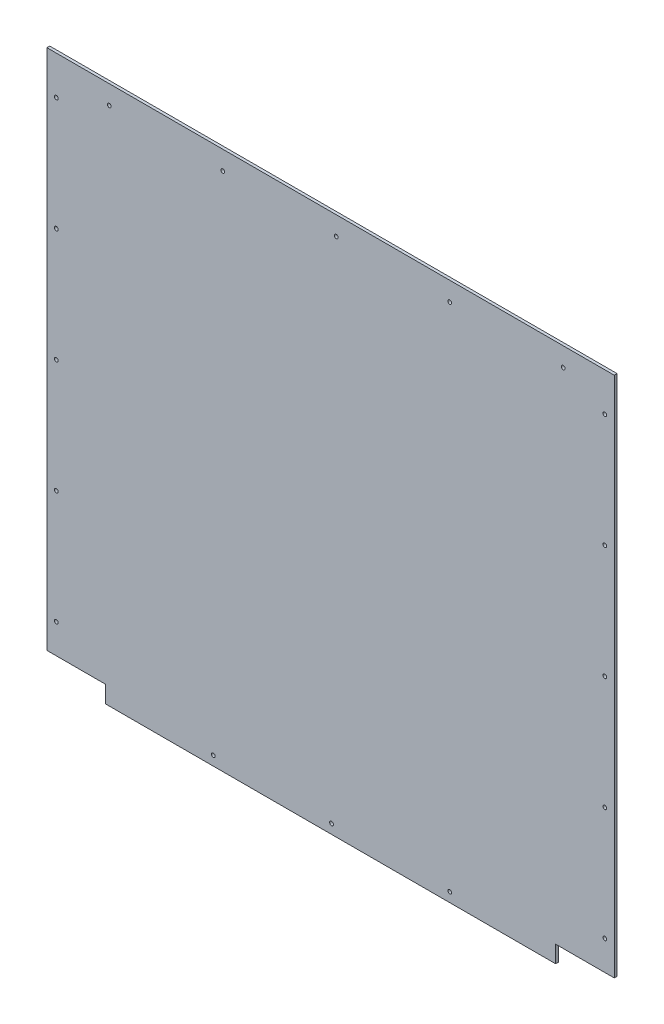
ISO-10303-21;
HEADER;
FILE_DESCRIPTION(('STEP AP214'),'2;1');
FILE_NAME('part.step','',(''),(''),'','','');
FILE_SCHEMA(('AUTOMOTIVE_DESIGN { 1 0 10303 214 1 1 1 1 }'));
ENDSEC;
DATA;
#1=APPLICATION_CONTEXT('core data for automotive mechanical design processes');
#2=APPLICATION_PROTOCOL_DEFINITION('international standard','automotive_design',2000,#1);
#3=PRODUCT_CONTEXT('',#1,'mechanical');
#4=PRODUCT('Part','Part','',(#3));
#5=PRODUCT_RELATED_PRODUCT_CATEGORY('part','',(#4));
#6=PRODUCT_DEFINITION_FORMATION('','',#4);
#7=PRODUCT_DEFINITION_CONTEXT('part definition',#1,'design');
#8=PRODUCT_DEFINITION('design','',#6,#7);
#9=PRODUCT_DEFINITION_SHAPE('','',#8);
#10=(LENGTH_UNIT() NAMED_UNIT(*) SI_UNIT(.MILLI.,.METRE.));
#11=(NAMED_UNIT(*) PLANE_ANGLE_UNIT() SI_UNIT($,.RADIAN.));
#12=(NAMED_UNIT(*) SI_UNIT($,.STERADIAN.) SOLID_ANGLE_UNIT());
#13=UNCERTAINTY_MEASURE_WITH_UNIT(LENGTH_MEASURE(1.E-05),#10,'distance_accuracy_value','');
#14=(GEOMETRIC_REPRESENTATION_CONTEXT(3) GLOBAL_UNCERTAINTY_ASSIGNED_CONTEXT((#13)) GLOBAL_UNIT_ASSIGNED_CONTEXT((#10,
#11,#12)) REPRESENTATION_CONTEXT('',''));
#15=CARTESIAN_POINT('',(0.,0.,0.));
#16=DIRECTION('',(0.,0.,1.));
#17=DIRECTION('',(1.,0.,0.));
#18=AXIS2_PLACEMENT_3D('',#15,#16,#17);
#19=CARTESIAN_POINT('',(0.,0.,3.));
#20=DIRECTION('',(1.,0.,0.));
#21=DIRECTION('',(0.,0.,-1.));
#22=AXIS2_PLACEMENT_3D('',#19,#20,#21);
#23=PLANE('',#22);
#24=DIRECTION('',(0.,-1.,0.));
#25=VECTOR('',#24,1.);
#26=CARTESIAN_POINT('',(0.,0.,0.));
#27=LINE('',#26,#25);
#28=CARTESIAN_POINT('',(0.,570.,0.));
#29=VERTEX_POINT('',#28);
#30=CARTESIAN_POINT('',(0.,18.,0.));
#31=VERTEX_POINT('',#30);
#32=EDGE_CURVE('E121',#29,#31,#27,.T.);
#33=ORIENTED_EDGE('',*,*,#32,.T.);
#34=DIRECTION('',(0.,0.,1.));
#35=VECTOR('',#34,1.);
#36=CARTESIAN_POINT('',(0.,18.,0.));
#37=LINE('',#36,#35);
#38=CARTESIAN_POINT('',(0.,18.,3.));
#39=VERTEX_POINT('',#38);
#40=EDGE_CURVE('E126',#31,#39,#37,.T.);
#41=ORIENTED_EDGE('',*,*,#40,.T.);
#42=DIRECTION('',(0.,-1.,0.));
#43=VECTOR('',#42,1.);
#44=CARTESIAN_POINT('',(0.,0.,3.));
#45=LINE('',#44,#43);
#46=CARTESIAN_POINT('',(0.,570.,3.));
#47=VERTEX_POINT('',#46);
#48=EDGE_CURVE('E130',#47,#39,#45,.T.);
#49=ORIENTED_EDGE('',*,*,#48,.F.);
#50=DIRECTION('',(0.,0.,-1.));
#51=VECTOR('',#50,1.);
#52=CARTESIAN_POINT('',(0.,570.,3.));
#53=LINE('',#52,#51);
#54=EDGE_CURVE('E42',#47,#29,#53,.T.);
#55=ORIENTED_EDGE('',*,*,#54,.T.);
#56=EDGE_LOOP('',(#33,#41,#49,#55));
#57=FACE_BOUND('',#56,.T.);
#58=ADVANCED_FACE('F35',(#57),#23,.F.);
#59=CARTESIAN_POINT('',(0.,0.,3.));
#60=DIRECTION('',(0.,1.,0.));
#61=DIRECTION('',(0.,0.,1.));
#62=AXIS2_PLACEMENT_3D('',#59,#60,#61);
#63=PLANE('',#62);
#64=DIRECTION('',(1.,0.,0.));
#65=VECTOR('',#64,1.);
#66=CARTESIAN_POINT('',(0.,0.,3.));
#67=LINE('',#66,#65);
#68=CARTESIAN_POINT('',(62.,0.,3.));
#69=VERTEX_POINT('',#68);
#70=CARTESIAN_POINT('',(538.,0.,3.));
#71=VERTEX_POINT('',#70);
#72=EDGE_CURVE('E116',#69,#71,#67,.T.);
#73=ORIENTED_EDGE('',*,*,#72,.F.);
#74=DIRECTION('',(0.,0.,1.));
#75=VECTOR('',#74,1.);
#76=CARTESIAN_POINT('',(62.,0.,0.));
#77=LINE('',#76,#75);
#78=CARTESIAN_POINT('',(62.,0.,0.));
#79=VERTEX_POINT('',#78);
#80=EDGE_CURVE('E102',#79,#69,#77,.T.);
#81=ORIENTED_EDGE('',*,*,#80,.F.);
#82=DIRECTION('',(1.,0.,0.));
#83=VECTOR('',#82,1.);
#84=CARTESIAN_POINT('',(0.,0.,0.));
#85=LINE('',#84,#83);
#86=CARTESIAN_POINT('',(538.,0.,0.));
#87=VERTEX_POINT('',#86);
#88=EDGE_CURVE('E114',#79,#87,#85,.T.);
#89=ORIENTED_EDGE('',*,*,#88,.T.);
#90=DIRECTION('',(0.,0.,1.));
#91=VECTOR('',#90,1.);
#92=CARTESIAN_POINT('',(538.,0.,0.));
#93=LINE('',#92,#91);
#94=EDGE_CURVE('E149',#87,#71,#93,.T.);
#95=ORIENTED_EDGE('',*,*,#94,.T.);
#96=EDGE_LOOP('',(#73,#81,#89,#95));
#97=FACE_BOUND('',#96,.T.);
#98=ADVANCED_FACE('F112',(#97),#63,.F.);
#99=CARTESIAN_POINT('',(600.,0.,3.));
#100=DIRECTION('',(-1.,0.,0.));
#101=DIRECTION('',(0.,0.,1.));
#102=AXIS2_PLACEMENT_3D('',#99,#100,#101);
#103=PLANE('',#102);
#104=DIRECTION('',(0.,1.,0.));
#105=VECTOR('',#104,1.);
#106=CARTESIAN_POINT('',(600.,0.,3.));
#107=LINE('',#106,#105);
#108=CARTESIAN_POINT('',(600.,18.,3.));
#109=VERTEX_POINT('',#108);
#110=CARTESIAN_POINT('',(600.,570.,3.));
#111=VERTEX_POINT('',#110);
#112=EDGE_CURVE('E137',#109,#111,#107,.T.);
#113=ORIENTED_EDGE('',*,*,#112,.F.);
#114=DIRECTION('',(0.,0.,1.));
#115=VECTOR('',#114,1.);
#116=CARTESIAN_POINT('',(600.,18.,0.));
#117=LINE('',#116,#115);
#118=CARTESIAN_POINT('',(600.,18.,0.));
#119=VERTEX_POINT('',#118);
#120=EDGE_CURVE('E145',#119,#109,#117,.T.);
#121=ORIENTED_EDGE('',*,*,#120,.F.);
#122=DIRECTION('',(0.,1.,0.));
#123=VECTOR('',#122,1.);
#124=CARTESIAN_POINT('',(600.,0.,0.));
#125=LINE('',#124,#123);
#126=CARTESIAN_POINT('',(600.,570.,0.));
#127=VERTEX_POINT('',#126);
#128=EDGE_CURVE('E120',#119,#127,#125,.T.);
#129=ORIENTED_EDGE('',*,*,#128,.T.);
#130=DIRECTION('',(0.,0.,-1.));
#131=VECTOR('',#130,1.);
#132=CARTESIAN_POINT('',(600.,570.,3.));
#133=LINE('',#132,#131);
#134=EDGE_CURVE('E11',#111,#127,#133,.T.);
#135=ORIENTED_EDGE('',*,*,#134,.F.);
#136=EDGE_LOOP('',(#113,#121,#129,#135));
#137=FACE_BOUND('',#136,.T.);
#138=ADVANCED_FACE('F336',(#137),#103,.F.);
#139=CARTESIAN_POINT('',(0.,570.,3.));
#140=DIRECTION('',(0.,-1.,0.));
#141=DIRECTION('',(0.,0.,-1.));
#142=AXIS2_PLACEMENT_3D('',#139,#140,#141);
#143=PLANE('',#142);
#144=DIRECTION('',(-1.,0.,0.));
#145=VECTOR('',#144,1.);
#146=CARTESIAN_POINT('',(0.,570.,0.));
#147=LINE('',#146,#145);
#148=EDGE_CURVE('E123',#127,#29,#147,.T.);
#149=ORIENTED_EDGE('',*,*,#148,.T.);
#150=ORIENTED_EDGE('',*,*,#54,.F.);
#151=DIRECTION('',(-1.,0.,0.));
#152=VECTOR('',#151,1.);
#153=CARTESIAN_POINT('',(0.,570.,3.));
#154=LINE('',#153,#152);
#155=EDGE_CURVE('E132',#111,#47,#154,.T.);
#156=ORIENTED_EDGE('',*,*,#155,.F.);
#157=ORIENTED_EDGE('',*,*,#134,.T.);
#158=EDGE_LOOP('',(#149,#150,#156,#157));
#159=FACE_BOUND('',#158,.T.);
#160=ADVANCED_FACE('F340',(#159),#143,.F.);
#161=CARTESIAN_POINT('',(0.,0.,3.));
#162=DIRECTION('',(0.,0.,-1.));
#163=DIRECTION('',(-1.,0.,0.));
#164=AXIS2_PLACEMENT_3D('',#161,#162,#163);
#165=PLANE('',#164);
#166=CARTESIAN_POINT('',(546.,550.,3.));
#167=DIRECTION('',(0.,0.,-1.));
#168=DIRECTION('',(-1.,0.,0.));
#169=AXIS2_PLACEMENT_3D('',#166,#167,#168);
#170=CIRCLE('',#169,2.);
#171=CARTESIAN_POINT('',(544.,550.,3.));
#172=VERTEX_POINT('',#171);
#173=EDGE_CURVE('E268',#172,#172,#170,.T.);
#174=ORIENTED_EDGE('',*,*,#173,.T.);
#175=EDGE_LOOP('',(#174));
#176=FACE_BOUND('',#175,.T.);
#177=CARTESIAN_POINT('',(590.,529.25,3.));
#178=DIRECTION('',(0.,0.,-1.));
#179=DIRECTION('',(-1.,0.,0.));
#180=AXIS2_PLACEMENT_3D('',#177,#178,#179);
#181=CIRCLE('',#180,2.);
#182=CARTESIAN_POINT('',(588.,529.25,3.));
#183=VERTEX_POINT('',#182);
#184=EDGE_CURVE('E262',#183,#183,#181,.T.);
#185=ORIENTED_EDGE('',*,*,#184,.T.);
#186=EDGE_LOOP('',(#185));
#187=FACE_BOUND('',#186,.T.);
#188=CARTESIAN_POINT('',(426.,10.,3.));
#189=DIRECTION('',(0.,0.,-1.));
#190=DIRECTION('',(-1.,0.,0.));
#191=AXIS2_PLACEMENT_3D('',#188,#189,#190);
#192=CIRCLE('',#191,2.);
#193=CARTESIAN_POINT('',(424.,10.,3.));
#194=VERTEX_POINT('',#193);
#195=EDGE_CURVE('E256',#194,#194,#192,.T.);
#196=ORIENTED_EDGE('',*,*,#195,.T.);
#197=EDGE_LOOP('',(#196));
#198=FACE_BOUND('',#197,.T.);
#199=CARTESIAN_POINT('',(426.,550.,3.));
#200=DIRECTION('',(0.,0.,-1.));
#201=DIRECTION('',(-1.,0.,0.));
#202=AXIS2_PLACEMENT_3D('',#199,#200,#201);
#203=CIRCLE('',#202,2.);
#204=CARTESIAN_POINT('',(424.,550.,3.));
#205=VERTEX_POINT('',#204);
#206=EDGE_CURVE('E250',#205,#205,#203,.T.);
#207=ORIENTED_EDGE('',*,*,#206,.T.);
#208=EDGE_LOOP('',(#207));
#209=FACE_BOUND('',#208,.T.);
#210=CARTESIAN_POINT('',(306.,550.,3.));
#211=DIRECTION('',(0.,0.,-1.));
#212=DIRECTION('',(-1.,0.,0.));
#213=AXIS2_PLACEMENT_3D('',#210,#211,#212);
#214=CIRCLE('',#213,2.);
#215=CARTESIAN_POINT('',(304.,550.,3.));
#216=VERTEX_POINT('',#215);
#217=EDGE_CURVE('E244',#216,#216,#214,.T.);
#218=ORIENTED_EDGE('',*,*,#217,.T.);
#219=EDGE_LOOP('',(#218));
#220=FACE_BOUND('',#219,.T.);
#221=CARTESIAN_POINT('',(186.,550.,3.));
#222=DIRECTION('',(0.,0.,-1.));
#223=DIRECTION('',(-1.,0.,0.));
#224=AXIS2_PLACEMENT_3D('',#221,#222,#223);
#225=CIRCLE('',#224,2.);
#226=CARTESIAN_POINT('',(184.,550.,3.));
#227=VERTEX_POINT('',#226);
#228=EDGE_CURVE('E238',#227,#227,#225,.T.);
#229=ORIENTED_EDGE('',*,*,#228,.T.);
#230=EDGE_LOOP('',(#229));
#231=FACE_BOUND('',#230,.T.);
#232=CARTESIAN_POINT('',(65.9999999999999,550.,3.));
#233=DIRECTION('',(0.,0.,-1.));
#234=DIRECTION('',(-1.,0.,0.));
#235=AXIS2_PLACEMENT_3D('',#232,#233,#234);
#236=CIRCLE('',#235,2.);
#237=CARTESIAN_POINT('',(63.9999999999999,550.,3.));
#238=VERTEX_POINT('',#237);
#239=EDGE_CURVE('E232',#238,#238,#236,.T.);
#240=ORIENTED_EDGE('',*,*,#239,.T.);
#241=EDGE_LOOP('',(#240));
#242=FACE_BOUND('',#241,.T.);
#243=CARTESIAN_POINT('',(10.,529.25,3.));
#244=DIRECTION('',(0.,0.,-1.));
#245=DIRECTION('',(-1.,0.,0.));
#246=AXIS2_PLACEMENT_3D('',#243,#244,#245);
#247=CIRCLE('',#246,2.);
#248=CARTESIAN_POINT('',(8.00000000000001,529.25,3.));
#249=VERTEX_POINT('',#248);
#250=EDGE_CURVE('E226',#249,#249,#247,.T.);
#251=ORIENTED_EDGE('',*,*,#250,.T.);
#252=EDGE_LOOP('',(#251));
#253=FACE_BOUND('',#252,.T.);
#254=CARTESIAN_POINT('',(9.99999999999879,409.25,3.));
#255=DIRECTION('',(0.,0.,-1.));
#256=DIRECTION('',(-1.,0.,0.));
#257=AXIS2_PLACEMENT_3D('',#254,#255,#256);
#258=CIRCLE('',#257,2.);
#259=CARTESIAN_POINT('',(7.99999999999879,409.25,3.));
#260=VERTEX_POINT('',#259);
#261=EDGE_CURVE('E220',#260,#260,#258,.T.);
#262=ORIENTED_EDGE('',*,*,#261,.T.);
#263=EDGE_LOOP('',(#262));
#264=FACE_BOUND('',#263,.T.);
#265=CARTESIAN_POINT('',(9.99999999999746,289.25,3.));
#266=DIRECTION('',(0.,0.,-1.));
#267=DIRECTION('',(-1.,0.,0.));
#268=AXIS2_PLACEMENT_3D('',#265,#266,#267);
#269=CIRCLE('',#268,2.);
#270=CARTESIAN_POINT('',(7.99999999999746,289.25,3.));
#271=VERTEX_POINT('',#270);
#272=EDGE_CURVE('E214',#271,#271,#269,.T.);
#273=ORIENTED_EDGE('',*,*,#272,.T.);
#274=EDGE_LOOP('',(#273));
#275=FACE_BOUND('',#274,.T.);
#276=CARTESIAN_POINT('',(9.99999999999623,169.25,3.));
#277=DIRECTION('',(0.,0.,-1.));
#278=DIRECTION('',(-1.,0.,0.));
#279=AXIS2_PLACEMENT_3D('',#276,#277,#278);
#280=CIRCLE('',#279,2.);
#281=CARTESIAN_POINT('',(7.99999999999624,169.25,3.));
#282=VERTEX_POINT('',#281);
#283=EDGE_CURVE('E208',#282,#282,#280,.T.);
#284=ORIENTED_EDGE('',*,*,#283,.T.);
#285=EDGE_LOOP('',(#284));
#286=FACE_BOUND('',#285,.T.);
#287=CARTESIAN_POINT('',(9.99999999999501,49.25,3.));
#288=DIRECTION('',(0.,0.,-1.));
#289=DIRECTION('',(-1.,0.,0.));
#290=AXIS2_PLACEMENT_3D('',#287,#288,#289);
#291=CIRCLE('',#290,2.);
#292=CARTESIAN_POINT('',(7.99999999999501,49.25,3.));
#293=VERTEX_POINT('',#292);
#294=EDGE_CURVE('E202',#293,#293,#291,.T.);
#295=ORIENTED_EDGE('',*,*,#294,.T.);
#296=EDGE_LOOP('',(#295));
#297=FACE_BOUND('',#296,.T.);
#298=CARTESIAN_POINT('',(589.999999999999,409.25,3.));
#299=DIRECTION('',(0.,0.,-1.));
#300=DIRECTION('',(-1.,0.,0.));
#301=AXIS2_PLACEMENT_3D('',#298,#299,#300);
#302=CIRCLE('',#301,2.);
#303=CARTESIAN_POINT('',(587.999999999999,409.25,3.));
#304=VERTEX_POINT('',#303);
#305=EDGE_CURVE('E196',#304,#304,#302,.T.);
#306=ORIENTED_EDGE('',*,*,#305,.T.);
#307=EDGE_LOOP('',(#306));
#308=FACE_BOUND('',#307,.T.);
#309=CARTESIAN_POINT('',(589.999999999997,289.25,3.));
#310=DIRECTION('',(0.,0.,-1.));
#311=DIRECTION('',(-1.,0.,0.));
#312=AXIS2_PLACEMENT_3D('',#309,#310,#311);
#313=CIRCLE('',#312,2.);
#314=CARTESIAN_POINT('',(587.999999999997,289.25,3.));
#315=VERTEX_POINT('',#314);
#316=EDGE_CURVE('E190',#315,#315,#313,.T.);
#317=ORIENTED_EDGE('',*,*,#316,.T.);
#318=EDGE_LOOP('',(#317));
#319=FACE_BOUND('',#318,.T.);
#320=CARTESIAN_POINT('',(589.999999999996,169.25,3.));
#321=DIRECTION('',(0.,0.,-1.));
#322=DIRECTION('',(-1.,0.,0.));
#323=AXIS2_PLACEMENT_3D('',#320,#321,#322);
#324=CIRCLE('',#323,2.);
#325=CARTESIAN_POINT('',(587.999999999996,169.25,3.));
#326=VERTEX_POINT('',#325);
#327=EDGE_CURVE('E184',#326,#326,#324,.T.);
#328=ORIENTED_EDGE('',*,*,#327,.T.);
#329=EDGE_LOOP('',(#328));
#330=FACE_BOUND('',#329,.T.);
#331=CARTESIAN_POINT('',(589.999999999995,49.25,3.));
#332=DIRECTION('',(0.,0.,-1.));
#333=DIRECTION('',(-1.,0.,0.));
#334=AXIS2_PLACEMENT_3D('',#331,#332,#333);
#335=CIRCLE('',#334,2.);
#336=CARTESIAN_POINT('',(587.999999999995,49.25,3.));
#337=VERTEX_POINT('',#336);
#338=EDGE_CURVE('E178',#337,#337,#335,.T.);
#339=ORIENTED_EDGE('',*,*,#338,.T.);
#340=EDGE_LOOP('',(#339));
#341=FACE_BOUND('',#340,.T.);
#342=CARTESIAN_POINT('',(301.,10.,3.));
#343=DIRECTION('',(0.,0.,-1.));
#344=DIRECTION('',(-1.,0.,0.));
#345=AXIS2_PLACEMENT_3D('',#342,#343,#344);
#346=CIRCLE('',#345,2.);
#347=CARTESIAN_POINT('',(299.,10.,3.));
#348=VERTEX_POINT('',#347);
#349=EDGE_CURVE('E172',#348,#348,#346,.T.);
#350=ORIENTED_EDGE('',*,*,#349,.T.);
#351=EDGE_LOOP('',(#350));
#352=FACE_BOUND('',#351,.T.);
#353=CARTESIAN_POINT('',(176.,10.,3.));
#354=DIRECTION('',(0.,0.,-1.));
#355=DIRECTION('',(-1.,0.,0.));
#356=AXIS2_PLACEMENT_3D('',#353,#354,#355);
#357=CIRCLE('',#356,2.);
#358=CARTESIAN_POINT('',(174.,10.,3.));
#359=VERTEX_POINT('',#358);
#360=EDGE_CURVE('E158',#359,#359,#357,.T.);
#361=ORIENTED_EDGE('',*,*,#360,.T.);
#362=EDGE_LOOP('',(#361));
#363=FACE_BOUND('',#362,.T.);
#364=ORIENTED_EDGE('',*,*,#48,.T.);
#365=DIRECTION('',(-1.,0.,0.));
#366=VECTOR('',#365,1.);
#367=CARTESIAN_POINT('',(0.,18.,3.));
#368=LINE('',#367,#366);
#369=CARTESIAN_POINT('',(62.,18.,3.));
#370=VERTEX_POINT('',#369);
#371=EDGE_CURVE('E107',#370,#39,#368,.T.);
#372=ORIENTED_EDGE('',*,*,#371,.F.);
#373=DIRECTION('',(0.,1.,0.));
#374=VECTOR('',#373,1.);
#375=CARTESIAN_POINT('',(62.,0.,3.));
#376=LINE('',#375,#374);
#377=EDGE_CURVE('E151',#69,#370,#376,.T.);
#378=ORIENTED_EDGE('',*,*,#377,.F.);
#379=ORIENTED_EDGE('',*,*,#72,.T.);
#380=DIRECTION('',(0.,-1.,0.));
#381=VECTOR('',#380,1.);
#382=CARTESIAN_POINT('',(538.,0.,3.));
#383=LINE('',#382,#381);
#384=CARTESIAN_POINT('',(538.,18.,3.));
#385=VERTEX_POINT('',#384);
#386=EDGE_CURVE('E152',#385,#71,#383,.T.);
#387=ORIENTED_EDGE('',*,*,#386,.F.);
#388=DIRECTION('',(-1.,0.,0.));
#389=VECTOR('',#388,1.);
#390=CARTESIAN_POINT('',(600.,18.,3.));
#391=LINE('',#390,#389);
#392=EDGE_CURVE('E155',#109,#385,#391,.T.);
#393=ORIENTED_EDGE('',*,*,#392,.F.);
#394=ORIENTED_EDGE('',*,*,#112,.T.);
#395=ORIENTED_EDGE('',*,*,#155,.T.);
#396=EDGE_LOOP('',(#364,#372,#378,#379,#387,#393,#394,#395));
#397=FACE_BOUND('',#396,.T.);
#398=ADVANCED_FACE('F280',(#176,#187,#198,#209,#220,#231,#242,#253,#264,#275,#286,#297,#308,
#319,#330,#341,#352,#363,#397),#165,.F.);
#399=CARTESIAN_POINT('',(0.,0.,0.));
#400=DIRECTION('',(0.,0.,-1.));
#401=DIRECTION('',(-1.,0.,0.));
#402=AXIS2_PLACEMENT_3D('',#399,#400,#401);
#403=PLANE('',#402);
#404=CARTESIAN_POINT('',(546.,550.,0.));
#405=DIRECTION('',(0.,0.,-1.));
#406=DIRECTION('',(-1.,0.,0.));
#407=AXIS2_PLACEMENT_3D('',#404,#405,#406);
#408=CIRCLE('',#407,2.);
#409=CARTESIAN_POINT('',(544.,550.,0.));
#410=VERTEX_POINT('',#409);
#411=EDGE_CURVE('E271',#410,#410,#408,.T.);
#412=ORIENTED_EDGE('',*,*,#411,.F.);
#413=EDGE_LOOP('',(#412));
#414=FACE_BOUND('',#413,.T.);
#415=CARTESIAN_POINT('',(590.,529.25,0.));
#416=DIRECTION('',(0.,0.,-1.));
#417=DIRECTION('',(-1.,0.,0.));
#418=AXIS2_PLACEMENT_3D('',#415,#416,#417);
#419=CIRCLE('',#418,2.);
#420=CARTESIAN_POINT('',(588.,529.25,0.));
#421=VERTEX_POINT('',#420);
#422=EDGE_CURVE('E265',#421,#421,#419,.T.);
#423=ORIENTED_EDGE('',*,*,#422,.F.);
#424=EDGE_LOOP('',(#423));
#425=FACE_BOUND('',#424,.T.);
#426=CARTESIAN_POINT('',(426.,10.,0.));
#427=DIRECTION('',(0.,0.,-1.));
#428=DIRECTION('',(-1.,0.,0.));
#429=AXIS2_PLACEMENT_3D('',#426,#427,#428);
#430=CIRCLE('',#429,2.);
#431=CARTESIAN_POINT('',(424.,10.,0.));
#432=VERTEX_POINT('',#431);
#433=EDGE_CURVE('E259',#432,#432,#430,.T.);
#434=ORIENTED_EDGE('',*,*,#433,.F.);
#435=EDGE_LOOP('',(#434));
#436=FACE_BOUND('',#435,.T.);
#437=CARTESIAN_POINT('',(426.,550.,0.));
#438=DIRECTION('',(0.,0.,-1.));
#439=DIRECTION('',(-1.,0.,0.));
#440=AXIS2_PLACEMENT_3D('',#437,#438,#439);
#441=CIRCLE('',#440,2.);
#442=CARTESIAN_POINT('',(424.,550.,0.));
#443=VERTEX_POINT('',#442);
#444=EDGE_CURVE('E253',#443,#443,#441,.T.);
#445=ORIENTED_EDGE('',*,*,#444,.F.);
#446=EDGE_LOOP('',(#445));
#447=FACE_BOUND('',#446,.T.);
#448=CARTESIAN_POINT('',(306.,550.,0.));
#449=DIRECTION('',(0.,0.,-1.));
#450=DIRECTION('',(-1.,0.,0.));
#451=AXIS2_PLACEMENT_3D('',#448,#449,#450);
#452=CIRCLE('',#451,2.);
#453=CARTESIAN_POINT('',(304.,550.,0.));
#454=VERTEX_POINT('',#453);
#455=EDGE_CURVE('E247',#454,#454,#452,.T.);
#456=ORIENTED_EDGE('',*,*,#455,.F.);
#457=EDGE_LOOP('',(#456));
#458=FACE_BOUND('',#457,.T.);
#459=CARTESIAN_POINT('',(186.,550.,0.));
#460=DIRECTION('',(0.,0.,-1.));
#461=DIRECTION('',(-1.,0.,0.));
#462=AXIS2_PLACEMENT_3D('',#459,#460,#461);
#463=CIRCLE('',#462,2.);
#464=CARTESIAN_POINT('',(184.,550.,0.));
#465=VERTEX_POINT('',#464);
#466=EDGE_CURVE('E241',#465,#465,#463,.T.);
#467=ORIENTED_EDGE('',*,*,#466,.F.);
#468=EDGE_LOOP('',(#467));
#469=FACE_BOUND('',#468,.T.);
#470=CARTESIAN_POINT('',(65.9999999999999,550.,0.));
#471=DIRECTION('',(0.,0.,-1.));
#472=DIRECTION('',(-1.,0.,0.));
#473=AXIS2_PLACEMENT_3D('',#470,#471,#472);
#474=CIRCLE('',#473,2.);
#475=CARTESIAN_POINT('',(63.9999999999999,550.,0.));
#476=VERTEX_POINT('',#475);
#477=EDGE_CURVE('E235',#476,#476,#474,.T.);
#478=ORIENTED_EDGE('',*,*,#477,.F.);
#479=EDGE_LOOP('',(#478));
#480=FACE_BOUND('',#479,.T.);
#481=CARTESIAN_POINT('',(10.,529.25,0.));
#482=DIRECTION('',(0.,0.,-1.));
#483=DIRECTION('',(-1.,0.,0.));
#484=AXIS2_PLACEMENT_3D('',#481,#482,#483);
#485=CIRCLE('',#484,2.);
#486=CARTESIAN_POINT('',(8.00000000000001,529.25,0.));
#487=VERTEX_POINT('',#486);
#488=EDGE_CURVE('E229',#487,#487,#485,.T.);
#489=ORIENTED_EDGE('',*,*,#488,.F.);
#490=EDGE_LOOP('',(#489));
#491=FACE_BOUND('',#490,.T.);
#492=CARTESIAN_POINT('',(9.99999999999879,409.25,0.));
#493=DIRECTION('',(0.,0.,-1.));
#494=DIRECTION('',(-1.,0.,0.));
#495=AXIS2_PLACEMENT_3D('',#492,#493,#494);
#496=CIRCLE('',#495,2.);
#497=CARTESIAN_POINT('',(7.99999999999879,409.25,0.));
#498=VERTEX_POINT('',#497);
#499=EDGE_CURVE('E223',#498,#498,#496,.T.);
#500=ORIENTED_EDGE('',*,*,#499,.F.);
#501=EDGE_LOOP('',(#500));
#502=FACE_BOUND('',#501,.T.);
#503=CARTESIAN_POINT('',(9.99999999999746,289.25,0.));
#504=DIRECTION('',(0.,0.,-1.));
#505=DIRECTION('',(-1.,0.,0.));
#506=AXIS2_PLACEMENT_3D('',#503,#504,#505);
#507=CIRCLE('',#506,2.);
#508=CARTESIAN_POINT('',(7.99999999999746,289.25,0.));
#509=VERTEX_POINT('',#508);
#510=EDGE_CURVE('E217',#509,#509,#507,.T.);
#511=ORIENTED_EDGE('',*,*,#510,.F.);
#512=EDGE_LOOP('',(#511));
#513=FACE_BOUND('',#512,.T.);
#514=CARTESIAN_POINT('',(9.99999999999623,169.25,0.));
#515=DIRECTION('',(0.,0.,-1.));
#516=DIRECTION('',(-1.,0.,0.));
#517=AXIS2_PLACEMENT_3D('',#514,#515,#516);
#518=CIRCLE('',#517,2.);
#519=CARTESIAN_POINT('',(7.99999999999623,169.25,0.));
#520=VERTEX_POINT('',#519);
#521=EDGE_CURVE('E211',#520,#520,#518,.T.);
#522=ORIENTED_EDGE('',*,*,#521,.F.);
#523=EDGE_LOOP('',(#522));
#524=FACE_BOUND('',#523,.T.);
#525=CARTESIAN_POINT('',(9.99999999999501,49.25,0.));
#526=DIRECTION('',(0.,0.,-1.));
#527=DIRECTION('',(-1.,0.,0.));
#528=AXIS2_PLACEMENT_3D('',#525,#526,#527);
#529=CIRCLE('',#528,2.);
#530=CARTESIAN_POINT('',(7.99999999999501,49.25,0.));
#531=VERTEX_POINT('',#530);
#532=EDGE_CURVE('E205',#531,#531,#529,.T.);
#533=ORIENTED_EDGE('',*,*,#532,.F.);
#534=EDGE_LOOP('',(#533));
#535=FACE_BOUND('',#534,.T.);
#536=CARTESIAN_POINT('',(589.999999999999,409.25,0.));
#537=DIRECTION('',(0.,0.,-1.));
#538=DIRECTION('',(-1.,0.,0.));
#539=AXIS2_PLACEMENT_3D('',#536,#537,#538);
#540=CIRCLE('',#539,2.);
#541=CARTESIAN_POINT('',(587.999999999999,409.25,0.));
#542=VERTEX_POINT('',#541);
#543=EDGE_CURVE('E199',#542,#542,#540,.T.);
#544=ORIENTED_EDGE('',*,*,#543,.F.);
#545=EDGE_LOOP('',(#544));
#546=FACE_BOUND('',#545,.T.);
#547=CARTESIAN_POINT('',(589.999999999997,289.25,0.));
#548=DIRECTION('',(0.,0.,-1.));
#549=DIRECTION('',(-1.,0.,0.));
#550=AXIS2_PLACEMENT_3D('',#547,#548,#549);
#551=CIRCLE('',#550,2.);
#552=CARTESIAN_POINT('',(587.999999999997,289.25,0.));
#553=VERTEX_POINT('',#552);
#554=EDGE_CURVE('E193',#553,#553,#551,.T.);
#555=ORIENTED_EDGE('',*,*,#554,.F.);
#556=EDGE_LOOP('',(#555));
#557=FACE_BOUND('',#556,.T.);
#558=CARTESIAN_POINT('',(589.999999999996,169.25,0.));
#559=DIRECTION('',(0.,0.,-1.));
#560=DIRECTION('',(-1.,0.,0.));
#561=AXIS2_PLACEMENT_3D('',#558,#559,#560);
#562=CIRCLE('',#561,2.);
#563=CARTESIAN_POINT('',(587.999999999996,169.25,0.));
#564=VERTEX_POINT('',#563);
#565=EDGE_CURVE('E187',#564,#564,#562,.T.);
#566=ORIENTED_EDGE('',*,*,#565,.F.);
#567=EDGE_LOOP('',(#566));
#568=FACE_BOUND('',#567,.T.);
#569=CARTESIAN_POINT('',(589.999999999995,49.25,0.));
#570=DIRECTION('',(0.,0.,-1.));
#571=DIRECTION('',(-1.,0.,0.));
#572=AXIS2_PLACEMENT_3D('',#569,#570,#571);
#573=CIRCLE('',#572,2.);
#574=CARTESIAN_POINT('',(587.999999999995,49.25,0.));
#575=VERTEX_POINT('',#574);
#576=EDGE_CURVE('E181',#575,#575,#573,.T.);
#577=ORIENTED_EDGE('',*,*,#576,.F.);
#578=EDGE_LOOP('',(#577));
#579=FACE_BOUND('',#578,.T.);
#580=CARTESIAN_POINT('',(301.,10.,0.));
#581=DIRECTION('',(0.,0.,-1.));
#582=DIRECTION('',(-1.,0.,0.));
#583=AXIS2_PLACEMENT_3D('',#580,#581,#582);
#584=CIRCLE('',#583,2.);
#585=CARTESIAN_POINT('',(299.,10.,0.));
#586=VERTEX_POINT('',#585);
#587=EDGE_CURVE('E175',#586,#586,#584,.T.);
#588=ORIENTED_EDGE('',*,*,#587,.F.);
#589=EDGE_LOOP('',(#588));
#590=FACE_BOUND('',#589,.T.);
#591=CARTESIAN_POINT('',(176.,10.,0.));
#592=DIRECTION('',(0.,0.,-1.));
#593=DIRECTION('',(-1.,0.,0.));
#594=AXIS2_PLACEMENT_3D('',#591,#592,#593);
#595=CIRCLE('',#594,2.);
#596=CARTESIAN_POINT('',(174.,10.,0.));
#597=VERTEX_POINT('',#596);
#598=EDGE_CURVE('E169',#597,#597,#595,.T.);
#599=ORIENTED_EDGE('',*,*,#598,.F.);
#600=EDGE_LOOP('',(#599));
#601=FACE_BOUND('',#600,.T.);
#602=DIRECTION('',(-1.,0.,0.));
#603=VECTOR('',#602,1.);
#604=CARTESIAN_POINT('',(0.,18.,0.));
#605=LINE('',#604,#603);
#606=CARTESIAN_POINT('',(62.,18.,0.));
#607=VERTEX_POINT('',#606);
#608=EDGE_CURVE('E49',#607,#31,#605,.T.);
#609=ORIENTED_EDGE('',*,*,#608,.T.);
#610=ORIENTED_EDGE('',*,*,#32,.F.);
#611=ORIENTED_EDGE('',*,*,#148,.F.);
#612=ORIENTED_EDGE('',*,*,#128,.F.);
#613=DIRECTION('',(-1.,0.,0.));
#614=VECTOR('',#613,1.);
#615=CARTESIAN_POINT('',(600.,18.,0.));
#616=LINE('',#615,#614);
#617=CARTESIAN_POINT('',(538.,18.,0.));
#618=VERTEX_POINT('',#617);
#619=EDGE_CURVE('E154',#119,#618,#616,.T.);
#620=ORIENTED_EDGE('',*,*,#619,.T.);
#621=DIRECTION('',(0.,-1.,0.));
#622=VECTOR('',#621,1.);
#623=CARTESIAN_POINT('',(538.,0.,0.));
#624=LINE('',#623,#622);
#625=EDGE_CURVE('E57',#618,#87,#624,.T.);
#626=ORIENTED_EDGE('',*,*,#625,.T.);
#627=ORIENTED_EDGE('',*,*,#88,.F.);
#628=DIRECTION('',(0.,1.,0.));
#629=VECTOR('',#628,1.);
#630=CARTESIAN_POINT('',(62.,0.,0.));
#631=LINE('',#630,#629);
#632=EDGE_CURVE('E98',#79,#607,#631,.T.);
#633=ORIENTED_EDGE('',*,*,#632,.T.);
#634=EDGE_LOOP('',(#609,#610,#611,#612,#620,#626,#627,#633));
#635=FACE_BOUND('',#634,.T.);
#636=ADVANCED_FACE('F118',(#414,#425,#436,#447,#458,#469,#480,#491,#502,#513,#524,#535,#546,
#557,#568,#579,#590,#601,#635),#403,.T.);
#637=CARTESIAN_POINT('',(538.,0.,0.));
#638=DIRECTION('',(-1.,0.,0.));
#639=DIRECTION('',(0.,0.,1.));
#640=AXIS2_PLACEMENT_3D('',#637,#638,#639);
#641=PLANE('',#640);
#642=ORIENTED_EDGE('',*,*,#386,.T.);
#643=ORIENTED_EDGE('',*,*,#94,.F.);
#644=ORIENTED_EDGE('',*,*,#625,.F.);
#645=DIRECTION('',(0.,0.,1.));
#646=VECTOR('',#645,1.);
#647=CARTESIAN_POINT('',(538.,18.,0.));
#648=LINE('',#647,#646);
#649=EDGE_CURVE('E147',#618,#385,#648,.T.);
#650=ORIENTED_EDGE('',*,*,#649,.T.);
#651=EDGE_LOOP('',(#642,#643,#644,#650));
#652=FACE_BOUND('',#651,.T.);
#653=ADVANCED_FACE('F279',(#652),#641,.F.);
#654=CARTESIAN_POINT('',(600.,18.,0.));
#655=DIRECTION('',(0.,1.,0.));
#656=DIRECTION('',(-1.,0.,0.));
#657=AXIS2_PLACEMENT_3D('',#654,#655,#656);
#658=PLANE('',#657);
#659=ORIENTED_EDGE('',*,*,#392,.T.);
#660=ORIENTED_EDGE('',*,*,#649,.F.);
#661=ORIENTED_EDGE('',*,*,#619,.F.);
#662=ORIENTED_EDGE('',*,*,#120,.T.);
#663=EDGE_LOOP('',(#659,#660,#661,#662));
#664=FACE_BOUND('',#663,.T.);
#665=ADVANCED_FACE('F347',(#664),#658,.F.);
#666=CARTESIAN_POINT('',(0.,18.,0.));
#667=DIRECTION('',(0.,1.,0.));
#668=DIRECTION('',(0.,0.,1.));
#669=AXIS2_PLACEMENT_3D('',#666,#667,#668);
#670=PLANE('',#669);
#671=ORIENTED_EDGE('',*,*,#371,.T.);
#672=ORIENTED_EDGE('',*,*,#40,.F.);
#673=ORIENTED_EDGE('',*,*,#608,.F.);
#674=DIRECTION('',(0.,0.,1.));
#675=VECTOR('',#674,1.);
#676=CARTESIAN_POINT('',(62.,18.,0.));
#677=LINE('',#676,#675);
#678=EDGE_CURVE('E104',#607,#370,#677,.T.);
#679=ORIENTED_EDGE('',*,*,#678,.T.);
#680=EDGE_LOOP('',(#671,#672,#673,#679));
#681=FACE_BOUND('',#680,.T.);
#682=ADVANCED_FACE('F328',(#681),#670,.F.);
#683=CARTESIAN_POINT('',(62.,0.,0.));
#684=DIRECTION('',(1.,0.,0.));
#685=DIRECTION('',(0.,0.,-1.));
#686=AXIS2_PLACEMENT_3D('',#683,#684,#685);
#687=PLANE('',#686);
#688=ORIENTED_EDGE('',*,*,#377,.T.);
#689=ORIENTED_EDGE('',*,*,#678,.F.);
#690=ORIENTED_EDGE('',*,*,#632,.F.);
#691=ORIENTED_EDGE('',*,*,#80,.T.);
#692=EDGE_LOOP('',(#688,#689,#690,#691));
#693=FACE_BOUND('',#692,.T.);
#694=ADVANCED_FACE('F101',(#693),#687,.F.);
#695=CARTESIAN_POINT('',(176.,10.,0.));
#696=DIRECTION('',(0.,0.,-1.));
#697=DIRECTION('',(-1.,0.,0.));
#698=AXIS2_PLACEMENT_3D('',#695,#696,#697);
#699=CYLINDRICAL_SURFACE('',#698,2.);
#700=ORIENTED_EDGE('',*,*,#360,.F.);
#701=EDGE_LOOP('',(#700));
#702=FACE_BOUND('',#701,.T.);
#703=ORIENTED_EDGE('',*,*,#598,.T.);
#704=EDGE_LOOP('',(#703));
#705=FACE_BOUND('',#704,.T.);
#706=ADVANCED_FACE('F316',(#702,#705),#699,.F.);
#707=CARTESIAN_POINT('',(301.,10.,0.));
#708=DIRECTION('',(0.,0.,-1.));
#709=DIRECTION('',(-1.,0.,0.));
#710=AXIS2_PLACEMENT_3D('',#707,#708,#709);
#711=CYLINDRICAL_SURFACE('',#710,2.);
#712=ORIENTED_EDGE('',*,*,#349,.F.);
#713=EDGE_LOOP('',(#712));
#714=FACE_BOUND('',#713,.T.);
#715=ORIENTED_EDGE('',*,*,#587,.T.);
#716=EDGE_LOOP('',(#715));
#717=FACE_BOUND('',#716,.T.);
#718=ADVANCED_FACE('F318',(#714,#717),#711,.F.);
#719=CARTESIAN_POINT('',(589.999999999995,49.25,0.));
#720=DIRECTION('',(0.,0.,-1.));
#721=DIRECTION('',(-1.,0.,0.));
#722=AXIS2_PLACEMENT_3D('',#719,#720,#721);
#723=CYLINDRICAL_SURFACE('',#722,2.);
#724=ORIENTED_EDGE('',*,*,#338,.F.);
#725=EDGE_LOOP('',(#724));
#726=FACE_BOUND('',#725,.T.);
#727=ORIENTED_EDGE('',*,*,#576,.T.);
#728=EDGE_LOOP('',(#727));
#729=FACE_BOUND('',#728,.T.);
#730=ADVANCED_FACE('F325',(#726,#729),#723,.F.);
#731=CARTESIAN_POINT('',(589.999999999996,169.25,0.));
#732=DIRECTION('',(0.,0.,-1.));
#733=DIRECTION('',(-1.,0.,0.));
#734=AXIS2_PLACEMENT_3D('',#731,#732,#733);
#735=CYLINDRICAL_SURFACE('',#734,2.);
#736=ORIENTED_EDGE('',*,*,#327,.F.);
#737=EDGE_LOOP('',(#736));
#738=FACE_BOUND('',#737,.T.);
#739=ORIENTED_EDGE('',*,*,#565,.T.);
#740=EDGE_LOOP('',(#739));
#741=FACE_BOUND('',#740,.T.);
#742=ADVANCED_FACE('F400',(#738,#741),#735,.F.);
#743=CARTESIAN_POINT('',(589.999999999997,289.25,0.));
#744=DIRECTION('',(0.,0.,-1.));
#745=DIRECTION('',(-1.,0.,0.));
#746=AXIS2_PLACEMENT_3D('',#743,#744,#745);
#747=CYLINDRICAL_SURFACE('',#746,2.);
#748=ORIENTED_EDGE('',*,*,#316,.F.);
#749=EDGE_LOOP('',(#748));
#750=FACE_BOUND('',#749,.T.);
#751=ORIENTED_EDGE('',*,*,#554,.T.);
#752=EDGE_LOOP('',(#751));
#753=FACE_BOUND('',#752,.T.);
#754=ADVANCED_FACE('F410',(#750,#753),#747,.F.);
#755=CARTESIAN_POINT('',(589.999999999999,409.25,0.));
#756=DIRECTION('',(0.,0.,-1.));
#757=DIRECTION('',(-1.,0.,0.));
#758=AXIS2_PLACEMENT_3D('',#755,#756,#757);
#759=CYLINDRICAL_SURFACE('',#758,2.);
#760=ORIENTED_EDGE('',*,*,#305,.F.);
#761=EDGE_LOOP('',(#760));
#762=FACE_BOUND('',#761,.T.);
#763=ORIENTED_EDGE('',*,*,#543,.T.);
#764=EDGE_LOOP('',(#763));
#765=FACE_BOUND('',#764,.T.);
#766=ADVANCED_FACE('F420',(#762,#765),#759,.F.);
#767=CARTESIAN_POINT('',(9.99999999999501,49.25,0.));
#768=DIRECTION('',(0.,0.,-1.));
#769=DIRECTION('',(-1.,0.,0.));
#770=AXIS2_PLACEMENT_3D('',#767,#768,#769);
#771=CYLINDRICAL_SURFACE('',#770,2.);
#772=ORIENTED_EDGE('',*,*,#294,.F.);
#773=EDGE_LOOP('',(#772));
#774=FACE_BOUND('',#773,.T.);
#775=ORIENTED_EDGE('',*,*,#532,.T.);
#776=EDGE_LOOP('',(#775));
#777=FACE_BOUND('',#776,.T.);
#778=ADVANCED_FACE('F430',(#774,#777),#771,.F.);
#779=CARTESIAN_POINT('',(9.99999999999623,169.25,0.));
#780=DIRECTION('',(0.,0.,-1.));
#781=DIRECTION('',(-1.,0.,0.));
#782=AXIS2_PLACEMENT_3D('',#779,#780,#781);
#783=CYLINDRICAL_SURFACE('',#782,2.);
#784=ORIENTED_EDGE('',*,*,#283,.F.);
#785=EDGE_LOOP('',(#784));
#786=FACE_BOUND('',#785,.T.);
#787=ORIENTED_EDGE('',*,*,#521,.T.);
#788=EDGE_LOOP('',(#787));
#789=FACE_BOUND('',#788,.T.);
#790=ADVANCED_FACE('F440',(#786,#789),#783,.F.);
#791=CARTESIAN_POINT('',(9.99999999999746,289.25,0.));
#792=DIRECTION('',(0.,0.,-1.));
#793=DIRECTION('',(-1.,0.,0.));
#794=AXIS2_PLACEMENT_3D('',#791,#792,#793);
#795=CYLINDRICAL_SURFACE('',#794,2.);
#796=ORIENTED_EDGE('',*,*,#272,.F.);
#797=EDGE_LOOP('',(#796));
#798=FACE_BOUND('',#797,.T.);
#799=ORIENTED_EDGE('',*,*,#510,.T.);
#800=EDGE_LOOP('',(#799));
#801=FACE_BOUND('',#800,.T.);
#802=ADVANCED_FACE('F450',(#798,#801),#795,.F.);
#803=CARTESIAN_POINT('',(9.99999999999879,409.25,0.));
#804=DIRECTION('',(0.,0.,-1.));
#805=DIRECTION('',(-1.,0.,0.));
#806=AXIS2_PLACEMENT_3D('',#803,#804,#805);
#807=CYLINDRICAL_SURFACE('',#806,2.);
#808=ORIENTED_EDGE('',*,*,#261,.F.);
#809=EDGE_LOOP('',(#808));
#810=FACE_BOUND('',#809,.T.);
#811=ORIENTED_EDGE('',*,*,#499,.T.);
#812=EDGE_LOOP('',(#811));
#813=FACE_BOUND('',#812,.T.);
#814=ADVANCED_FACE('F460',(#810,#813),#807,.F.);
#815=CARTESIAN_POINT('',(10.,529.25,0.));
#816=DIRECTION('',(0.,0.,-1.));
#817=DIRECTION('',(-1.,0.,0.));
#818=AXIS2_PLACEMENT_3D('',#815,#816,#817);
#819=CYLINDRICAL_SURFACE('',#818,2.);
#820=ORIENTED_EDGE('',*,*,#250,.F.);
#821=EDGE_LOOP('',(#820));
#822=FACE_BOUND('',#821,.T.);
#823=ORIENTED_EDGE('',*,*,#488,.T.);
#824=EDGE_LOOP('',(#823));
#825=FACE_BOUND('',#824,.T.);
#826=ADVANCED_FACE('F470',(#822,#825),#819,.F.);
#827=CARTESIAN_POINT('',(65.9999999999999,550.,0.));
#828=DIRECTION('',(0.,0.,-1.));
#829=DIRECTION('',(-1.,0.,0.));
#830=AXIS2_PLACEMENT_3D('',#827,#828,#829);
#831=CYLINDRICAL_SURFACE('',#830,2.);
#832=ORIENTED_EDGE('',*,*,#239,.F.);
#833=EDGE_LOOP('',(#832));
#834=FACE_BOUND('',#833,.T.);
#835=ORIENTED_EDGE('',*,*,#477,.T.);
#836=EDGE_LOOP('',(#835));
#837=FACE_BOUND('',#836,.T.);
#838=ADVANCED_FACE('F480',(#834,#837),#831,.F.);
#839=CARTESIAN_POINT('',(186.,550.,0.));
#840=DIRECTION('',(0.,0.,-1.));
#841=DIRECTION('',(-1.,0.,0.));
#842=AXIS2_PLACEMENT_3D('',#839,#840,#841);
#843=CYLINDRICAL_SURFACE('',#842,2.);
#844=ORIENTED_EDGE('',*,*,#228,.F.);
#845=EDGE_LOOP('',(#844));
#846=FACE_BOUND('',#845,.T.);
#847=ORIENTED_EDGE('',*,*,#466,.T.);
#848=EDGE_LOOP('',(#847));
#849=FACE_BOUND('',#848,.T.);
#850=ADVANCED_FACE('F490',(#846,#849),#843,.F.);
#851=CARTESIAN_POINT('',(306.,550.,0.));
#852=DIRECTION('',(0.,0.,-1.));
#853=DIRECTION('',(-1.,0.,0.));
#854=AXIS2_PLACEMENT_3D('',#851,#852,#853);
#855=CYLINDRICAL_SURFACE('',#854,2.);
#856=ORIENTED_EDGE('',*,*,#217,.F.);
#857=EDGE_LOOP('',(#856));
#858=FACE_BOUND('',#857,.T.);
#859=ORIENTED_EDGE('',*,*,#455,.T.);
#860=EDGE_LOOP('',(#859));
#861=FACE_BOUND('',#860,.T.);
#862=ADVANCED_FACE('F500',(#858,#861),#855,.F.);
#863=CARTESIAN_POINT('',(426.,550.,0.));
#864=DIRECTION('',(0.,0.,-1.));
#865=DIRECTION('',(-1.,0.,0.));
#866=AXIS2_PLACEMENT_3D('',#863,#864,#865);
#867=CYLINDRICAL_SURFACE('',#866,2.);
#868=ORIENTED_EDGE('',*,*,#206,.F.);
#869=EDGE_LOOP('',(#868));
#870=FACE_BOUND('',#869,.T.);
#871=ORIENTED_EDGE('',*,*,#444,.T.);
#872=EDGE_LOOP('',(#871));
#873=FACE_BOUND('',#872,.T.);
#874=ADVANCED_FACE('F510',(#870,#873),#867,.F.);
#875=CARTESIAN_POINT('',(426.,10.,0.));
#876=DIRECTION('',(0.,0.,-1.));
#877=DIRECTION('',(-1.,0.,0.));
#878=AXIS2_PLACEMENT_3D('',#875,#876,#877);
#879=CYLINDRICAL_SURFACE('',#878,2.);
#880=ORIENTED_EDGE('',*,*,#195,.F.);
#881=EDGE_LOOP('',(#880));
#882=FACE_BOUND('',#881,.T.);
#883=ORIENTED_EDGE('',*,*,#433,.T.);
#884=EDGE_LOOP('',(#883));
#885=FACE_BOUND('',#884,.T.);
#886=ADVANCED_FACE('F520',(#882,#885),#879,.F.);
#887=CARTESIAN_POINT('',(590.,529.25,0.));
#888=DIRECTION('',(0.,0.,-1.));
#889=DIRECTION('',(-1.,0.,0.));
#890=AXIS2_PLACEMENT_3D('',#887,#888,#889);
#891=CYLINDRICAL_SURFACE('',#890,2.);
#892=ORIENTED_EDGE('',*,*,#184,.F.);
#893=EDGE_LOOP('',(#892));
#894=FACE_BOUND('',#893,.T.);
#895=ORIENTED_EDGE('',*,*,#422,.T.);
#896=EDGE_LOOP('',(#895));
#897=FACE_BOUND('',#896,.T.);
#898=ADVANCED_FACE('F530',(#894,#897),#891,.F.);
#899=CARTESIAN_POINT('',(546.,550.,0.));
#900=DIRECTION('',(0.,0.,-1.));
#901=DIRECTION('',(-1.,0.,0.));
#902=AXIS2_PLACEMENT_3D('',#899,#900,#901);
#903=CYLINDRICAL_SURFACE('',#902,2.);
#904=ORIENTED_EDGE('',*,*,#173,.F.);
#905=EDGE_LOOP('',(#904));
#906=FACE_BOUND('',#905,.T.);
#907=ORIENTED_EDGE('',*,*,#411,.T.);
#908=EDGE_LOOP('',(#907));
#909=FACE_BOUND('',#908,.T.);
#910=ADVANCED_FACE('F275',(#906,#909),#903,.F.);
#911=CLOSED_SHELL('',(#58,#98,#138,#160,#398,#636,#653,#665,#682,#694,#706,#718,#730,#742,#754,
#766,#778,#790,#802,#814,#826,#838,#850,#862,#874,#886,#898,#910));
#912=MANIFOLD_SOLID_BREP('B2',#911);
#913=ADVANCED_BREP_SHAPE_REPRESENTATION('',(#18,#912),#14);
#914=SHAPE_DEFINITION_REPRESENTATION(#9,#913);
ENDSEC;
END-ISO-10303-21;
